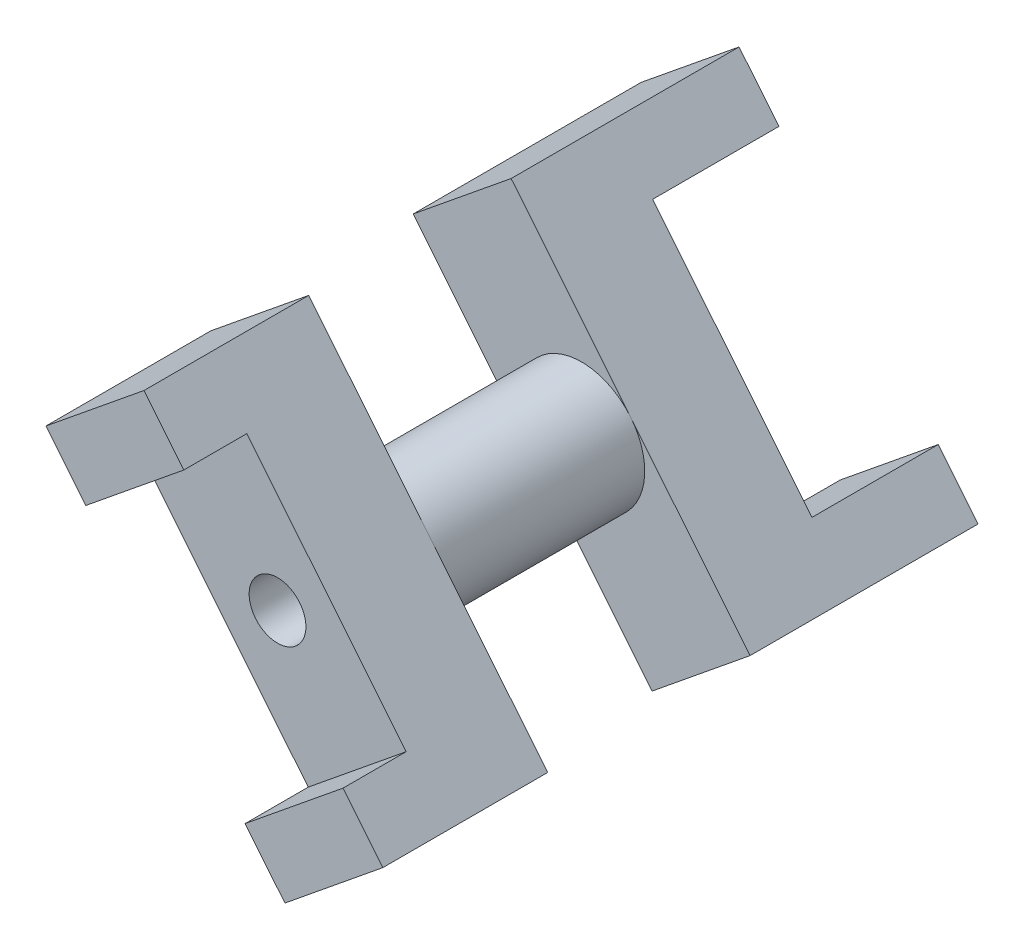
ISO-10303-21;
HEADER;
FILE_DESCRIPTION(('STEP AP214'),'2;1');
FILE_NAME('part.step','',(''),(''),'','','');
FILE_SCHEMA(('AUTOMOTIVE_DESIGN { 1 0 10303 214 1 1 1 1 }'));
ENDSEC;
DATA;
#1=APPLICATION_CONTEXT('core data for automotive mechanical design processes');
#2=APPLICATION_PROTOCOL_DEFINITION('international standard','automotive_design',2000,#1);
#3=PRODUCT_CONTEXT('',#1,'mechanical');
#4=PRODUCT('Part','Part','',(#3));
#5=PRODUCT_RELATED_PRODUCT_CATEGORY('part','',(#4));
#6=PRODUCT_DEFINITION_FORMATION('','',#4);
#7=PRODUCT_DEFINITION_CONTEXT('part definition',#1,'design');
#8=PRODUCT_DEFINITION('design','',#6,#7);
#9=PRODUCT_DEFINITION_SHAPE('','',#8);
#10=(LENGTH_UNIT() NAMED_UNIT(*) SI_UNIT(.MILLI.,.METRE.));
#11=(NAMED_UNIT(*) PLANE_ANGLE_UNIT() SI_UNIT($,.RADIAN.));
#12=(NAMED_UNIT(*) SI_UNIT($,.STERADIAN.) SOLID_ANGLE_UNIT());
#13=UNCERTAINTY_MEASURE_WITH_UNIT(LENGTH_MEASURE(1.E-05),#10,'distance_accuracy_value','');
#14=(GEOMETRIC_REPRESENTATION_CONTEXT(3) GLOBAL_UNCERTAINTY_ASSIGNED_CONTEXT((#13)) GLOBAL_UNIT_ASSIGNED_CONTEXT((#10,
#11,#12)) REPRESENTATION_CONTEXT('',''));
#15=CARTESIAN_POINT('',(0.,0.,0.));
#16=DIRECTION('',(0.,0.,1.));
#17=DIRECTION('',(1.,0.,0.));
#18=AXIS2_PLACEMENT_3D('',#15,#16,#17);
#19=CARTESIAN_POINT('',(0.,0.,27.7786382122968));
#20=DIRECTION('',(0.,0.,-1.));
#21=DIRECTION('',(-1.,0.,0.));
#22=AXIS2_PLACEMENT_3D('',#19,#20,#21);
#23=CYLINDRICAL_SURFACE('',#22,3.);
#24=CARTESIAN_POINT('',(0.,0.,4.83606185530663));
#25=DIRECTION('',(0.,0.,1.));
#26=DIRECTION('',(1.,0.,0.));
#27=AXIS2_PLACEMENT_3D('',#24,#25,#26);
#28=CIRCLE('',#27,3.);
#29=CARTESIAN_POINT('',(-2.32729027640222,-1.89307157005848,4.83606185530663));
#30=VERTEX_POINT('',#29);
#31=CARTESIAN_POINT('',(2.32729027640222,1.89307157005847,4.83606185530663));
#32=VERTEX_POINT('',#31);
#33=EDGE_CURVE('E202',#30,#32,#28,.T.);
#34=ORIENTED_EDGE('',*,*,#33,.T.);
#35=EDGE_CURVE('E174',#32,#30,#28,.T.);
#36=ORIENTED_EDGE('',*,*,#35,.T.);
#37=EDGE_LOOP('',(#34,#36));
#38=FACE_BOUND('',#37,.T.);
#39=CARTESIAN_POINT('',(0.,0.,14.4572949827516));
#40=DIRECTION('',(0.,0.,-1.));
#41=DIRECTION('',(0.,1.,0.));
#42=AXIS2_PLACEMENT_3D('',#39,#40,#41);
#43=CIRCLE('',#42,3.);
#44=CARTESIAN_POINT('',(-2.32729027640222,-1.89307157005848,14.4572949827516));
#45=VERTEX_POINT('',#44);
#46=CARTESIAN_POINT('',(2.32729027640222,1.89307157005847,14.4572949827516));
#47=VERTEX_POINT('',#46);
#48=EDGE_CURVE('E294',#45,#47,#43,.T.);
#49=ORIENTED_EDGE('',*,*,#48,.T.);
#50=EDGE_CURVE('E297',#47,#45,#43,.T.);
#51=ORIENTED_EDGE('',*,*,#50,.T.);
#52=EDGE_LOOP('',(#49,#51));
#53=FACE_BOUND('',#52,.T.);
#54=ADVANCED_FACE('F40',(#38,#53),#23,.T.);
#55=CARTESIAN_POINT('',(24.3052970762707,8.16901402016077,14.4572949827516));
#56=DIRECTION('',(0.,0.,-1.));
#57=DIRECTION('',(0.,1.,0.));
#58=AXIS2_PLACEMENT_3D('',#55,#56,#57);
#59=PLANE('',#58);
#60=ORIENTED_EDGE('',*,*,#50,.F.);
#61=DIRECTION('',(0.631023856686159,-0.775763425467408,0.));
#62=VECTOR('',#61,1.);
#63=CARTESIAN_POINT('',(8.00650498657763,-5.08879925914817,14.4572949827516));
#64=LINE('',#63,#62);
#65=CARTESIAN_POINT('',(8.00650498657764,-5.08879925914818,14.4572949827516));
#66=VERTEX_POINT('',#65);
#67=EDGE_CURVE('E265',#47,#66,#64,.T.);
#68=ORIENTED_EDGE('',*,*,#67,.T.);
#69=DIRECTION('',(-0.775763425467407,-0.631023856686159,0.));
#70=VECTOR('',#69,1.);
#71=CARTESIAN_POINT('',(24.3052970762707,8.16901402016077,14.4572949827516));
#72=LINE('',#71,#70);
#73=CARTESIAN_POINT('',(3.3519244337732,-8.87494239926513,14.4572949827516));
#74=VERTEX_POINT('',#73);
#75=EDGE_CURVE('E262',#66,#74,#72,.T.);
#76=ORIENTED_EDGE('',*,*,#75,.T.);
#77=DIRECTION('',(0.631023856686159,-0.775763425467407,0.));
#78=VECTOR('',#77,1.);
#79=CARTESIAN_POINT('',(3.3519244337732,-8.87494239926513,14.4572949827516));
#80=LINE('',#79,#78);
#81=EDGE_CURVE('E227',#45,#74,#80,.T.);
#82=ORIENTED_EDGE('',*,*,#81,.F.);
#83=EDGE_LOOP('',(#60,#68,#76,#82));
#84=FACE_BOUND('',#83,.T.);
#85=ADVANCED_FACE('F308',(#84),#59,.T.);
#86=CARTESIAN_POINT('',(-3.3519244337732,8.87494239926513,12.5851529055589));
#87=DIRECTION('',(0.775763425467408,0.631023856686159,0.));
#88=DIRECTION('',(-0.631023856686159,0.775763425467408,0.));
#89=AXIS2_PLACEMENT_3D('',#86,#87,#88);
#90=PLANE('',#89);
#91=ORIENTED_EDGE('',*,*,#67,.F.);
#92=CARTESIAN_POINT('',(-3.35192443377321,8.87494239926513,14.4572949827516));
#93=VERTEX_POINT('',#92);
#94=EDGE_CURVE('E64',#93,#47,#64,.T.);
#95=ORIENTED_EDGE('',*,*,#94,.F.);
#96=DIRECTION('',(0.,0.,-1.));
#97=VECTOR('',#96,1.);
#98=CARTESIAN_POINT('',(-3.35192443377321,8.87494239926513,19.2933568380583));
#99=LINE('',#98,#97);
#100=CARTESIAN_POINT('',(-3.35192443377321,8.87494239926514,22.2933568380583));
#101=VERTEX_POINT('',#100);
#102=EDGE_CURVE('E266',#101,#93,#99,.T.);
#103=ORIENTED_EDGE('',*,*,#102,.F.);
#104=DIRECTION('',(-0.631023856686159,0.775763425467408,0.));
#105=VECTOR('',#104,1.);
#106=CARTESIAN_POINT('',(-3.35192443377321,8.87494239926514,22.2933568380583));
#107=LINE('',#106,#105);
#108=CARTESIAN_POINT('',(-1.45885286371473,6.54765212286291,22.2933568380583));
#109=VERTEX_POINT('',#108);
#110=EDGE_CURVE('E272',#109,#101,#107,.T.);
#111=ORIENTED_EDGE('',*,*,#110,.F.);
#112=DIRECTION('',(0.,0.,1.));
#113=VECTOR('',#112,1.);
#114=CARTESIAN_POINT('',(-1.45885286371473,6.54765212286291,22.2933568380583));
#115=LINE('',#114,#113);
#116=CARTESIAN_POINT('',(-1.45885286371473,6.54765212286291,19.2933568380583));
#117=VERTEX_POINT('',#116);
#118=EDGE_CURVE('E214',#117,#109,#115,.T.);
#119=ORIENTED_EDGE('',*,*,#118,.F.);
#120=DIRECTION('',(-0.631023856686159,0.775763425467408,0.));
#121=VECTOR('',#120,1.);
#122=CARTESIAN_POINT('',(4.22036184646078,-0.434218706343846,19.2933568380583));
#123=LINE('',#122,#121);
#124=CARTESIAN_POINT('',(6.11343341651917,-2.76150898274596,19.2933568380583));
#125=VERTEX_POINT('',#124);
#126=EDGE_CURVE('E243',#125,#117,#123,.T.);
#127=ORIENTED_EDGE('',*,*,#126,.F.);
#128=DIRECTION('',(0.,0.,-1.));
#129=VECTOR('',#128,1.);
#130=CARTESIAN_POINT('',(6.11343341651917,-2.76150898274596,22.2933568380583));
#131=LINE('',#130,#129);
#132=CARTESIAN_POINT('',(6.11343341651917,-2.76150898274596,22.2933568380583));
#133=VERTEX_POINT('',#132);
#134=EDGE_CURVE('E248',#133,#125,#131,.T.);
#135=ORIENTED_EDGE('',*,*,#134,.F.);
#136=DIRECTION('',(-0.631023856686159,0.775763425467408,0.));
#137=VECTOR('',#136,1.);
#138=CARTESIAN_POINT('',(8.00650498657763,-5.08879925914818,22.2933568380583));
#139=LINE('',#138,#137);
#140=CARTESIAN_POINT('',(8.00650498657764,-5.08879925914819,22.2933568380583));
#141=VERTEX_POINT('',#140);
#142=EDGE_CURVE('E253',#141,#133,#139,.T.);
#143=ORIENTED_EDGE('',*,*,#142,.F.);
#144=DIRECTION('',(0.,0.,1.));
#145=VECTOR('',#144,1.);
#146=CARTESIAN_POINT('',(8.00650498657764,-5.08879925914818,19.2933568380583));
#147=LINE('',#146,#145);
#148=EDGE_CURVE('E258',#66,#141,#147,.T.);
#149=ORIENTED_EDGE('',*,*,#148,.F.);
#150=EDGE_LOOP('',(#91,#95,#103,#111,#119,#127,#135,#143,#149));
#151=FACE_BOUND('',#150,.T.);
#152=ADVANCED_FACE('F322',(#151),#90,.T.);
#153=CARTESIAN_POINT('',(-2.32729027640222,-1.89307157005848,0.));
#154=DIRECTION('',(0.775763425467407,0.631023856686159,0.));
#155=DIRECTION('',(-0.631023856686159,0.775763425467407,0.));
#156=AXIS2_PLACEMENT_3D('',#153,#154,#155);
#157=PLANE('',#156);
#158=DIRECTION('',(-0.631023856686159,0.775763425467407,0.));
#159=VECTOR('',#158,1.);
#160=CARTESIAN_POINT('',(-0.434218706343658,-4.22036184646081,19.2933568380583));
#161=LINE('',#160,#159);
#162=CARTESIAN_POINT('',(1.45885286371473,-6.54765212286291,19.2933568380583));
#163=VERTEX_POINT('',#162);
#164=CARTESIAN_POINT('',(-6.11343341651917,2.76150898274595,19.2933568380583));
#165=VERTEX_POINT('',#164);
#166=EDGE_CURVE('E206',#163,#165,#161,.T.);
#167=ORIENTED_EDGE('',*,*,#166,.T.);
#168=DIRECTION('',(0.,0.,1.));
#169=VECTOR('',#168,1.);
#170=CARTESIAN_POINT('',(-6.11343341651917,2.76150898274595,22.2933568380583));
#171=LINE('',#170,#169);
#172=CARTESIAN_POINT('',(-6.11343341651917,2.76150898274595,22.2933568380583));
#173=VERTEX_POINT('',#172);
#174=EDGE_CURVE('E209',#165,#173,#171,.T.);
#175=ORIENTED_EDGE('',*,*,#174,.T.);
#176=DIRECTION('',(-0.63102385668616,0.775763425467407,0.));
#177=VECTOR('',#176,1.);
#178=CARTESIAN_POINT('',(-8.00650498657765,5.08879925914818,22.2933568380583));
#179=LINE('',#178,#177);
#180=CARTESIAN_POINT('',(-8.00650498657765,5.08879925914818,22.2933568380583));
#181=VERTEX_POINT('',#180);
#182=EDGE_CURVE('E232',#173,#181,#179,.T.);
#183=ORIENTED_EDGE('',*,*,#182,.T.);
#184=DIRECTION('',(0.,0.,-1.));
#185=VECTOR('',#184,1.);
#186=CARTESIAN_POINT('',(-8.00650498657765,5.08879925914818,19.2933568380583));
#187=LINE('',#186,#185);
#188=CARTESIAN_POINT('',(-8.00650498657765,5.08879925914818,14.4572949827516));
#189=VERTEX_POINT('',#188);
#190=EDGE_CURVE('E228',#181,#189,#187,.T.);
#191=ORIENTED_EDGE('',*,*,#190,.T.);
#192=EDGE_CURVE('E223',#189,#45,#80,.T.);
#193=ORIENTED_EDGE('',*,*,#192,.T.);
#194=ORIENTED_EDGE('',*,*,#81,.T.);
#195=DIRECTION('',(0.,0.,1.));
#196=VECTOR('',#195,1.);
#197=CARTESIAN_POINT('',(3.3519244337732,-8.87494239926513,19.2933568380583));
#198=LINE('',#197,#196);
#199=CARTESIAN_POINT('',(3.3519244337732,-8.87494239926514,22.2933568380583));
#200=VERTEX_POINT('',#199);
#201=EDGE_CURVE('E219',#74,#200,#198,.T.);
#202=ORIENTED_EDGE('',*,*,#201,.T.);
#203=DIRECTION('',(-0.631023856686159,0.775763425467407,0.));
#204=VECTOR('',#203,1.);
#205=CARTESIAN_POINT('',(3.3519244337732,-8.87494239926514,22.2933568380583));
#206=LINE('',#205,#204);
#207=CARTESIAN_POINT('',(1.45885286371473,-6.54765212286291,22.2933568380583));
#208=VERTEX_POINT('',#207);
#209=EDGE_CURVE('E215',#200,#208,#206,.T.);
#210=ORIENTED_EDGE('',*,*,#209,.T.);
#211=DIRECTION('',(0.,0.,-1.));
#212=VECTOR('',#211,1.);
#213=CARTESIAN_POINT('',(1.45885286371473,-6.54765212286291,22.2933568380583));
#214=LINE('',#213,#212);
#215=EDGE_CURVE('E210',#208,#163,#214,.T.);
#216=ORIENTED_EDGE('',*,*,#215,.T.);
#217=EDGE_LOOP('',(#167,#175,#183,#191,#193,#194,#202,#210,#216));
#218=FACE_BOUND('',#217,.T.);
#219=ADVANCED_FACE('F315',(#218),#157,.F.);
#220=CARTESIAN_POINT('',(14.8399392259783,19.8054654021719,22.2933568380583));
#221=DIRECTION('',(0.631023856686159,-0.775763425467407,0.));
#222=DIRECTION('',(0.775763425467407,0.631023856686159,0.));
#223=AXIS2_PLACEMENT_3D('',#220,#221,#222);
#224=PLANE('',#223);
#225=DIRECTION('',(-0.775763425467407,-0.631023856686159,0.));
#226=VECTOR('',#225,1.);
#227=CARTESIAN_POINT('',(14.8399392259783,19.8054654021719,19.2933568380583));
#228=LINE('',#227,#226);
#229=EDGE_CURVE('E246',#117,#165,#228,.T.);
#230=ORIENTED_EDGE('',*,*,#229,.F.);
#231=ORIENTED_EDGE('',*,*,#118,.T.);
#232=DIRECTION('',(-0.775763425467407,-0.631023856686159,0.));
#233=VECTOR('',#232,1.);
#234=CARTESIAN_POINT('',(14.8399392259783,19.8054654021719,22.2933568380583));
#235=LINE('',#234,#233);
#236=EDGE_CURVE('E242',#109,#173,#235,.T.);
#237=ORIENTED_EDGE('',*,*,#236,.T.);
#238=ORIENTED_EDGE('',*,*,#174,.F.);
#239=EDGE_LOOP('',(#230,#231,#237,#238));
#240=FACE_BOUND('',#239,.T.);
#241=ADVANCED_FACE('F478',(#240),#224,.T.);
#242=CARTESIAN_POINT('',(12.9468676559199,22.1327556785741,22.2933568380583));
#243=DIRECTION('',(0.,0.,1.));
#244=DIRECTION('',(1.,0.,0.));
#245=AXIS2_PLACEMENT_3D('',#242,#243,#244);
#246=PLANE('',#245);
#247=ORIENTED_EDGE('',*,*,#236,.F.);
#248=ORIENTED_EDGE('',*,*,#110,.T.);
#249=DIRECTION('',(-0.775763425467407,-0.631023856686159,0.));
#250=VECTOR('',#249,1.);
#251=CARTESIAN_POINT('',(12.9468676559199,22.1327556785741,22.2933568380583));
#252=LINE('',#251,#250);
#253=EDGE_CURVE('E271',#101,#181,#252,.T.);
#254=ORIENTED_EDGE('',*,*,#253,.T.);
#255=ORIENTED_EDGE('',*,*,#182,.F.);
#256=EDGE_LOOP('',(#247,#248,#254,#255));
#257=FACE_BOUND('',#256,.T.);
#258=ADVANCED_FACE('F474',(#257),#246,.T.);
#259=CARTESIAN_POINT('',(12.9468676559199,22.1327556785741,19.2933568380583));
#260=DIRECTION('',(-0.631023856686159,0.775763425467407,0.));
#261=DIRECTION('',(-0.775763425467407,-0.631023856686159,0.));
#262=AXIS2_PLACEMENT_3D('',#259,#260,#261);
#263=PLANE('',#262);
#264=ORIENTED_EDGE('',*,*,#253,.F.);
#265=ORIENTED_EDGE('',*,*,#102,.T.);
#266=DIRECTION('',(-0.775763425467407,-0.631023856686159,0.));
#267=VECTOR('',#266,1.);
#268=CARTESIAN_POINT('',(12.9468676559199,22.1327556785741,14.4572949827516));
#269=LINE('',#268,#267);
#270=EDGE_CURVE('E270',#93,#189,#269,.T.);
#271=ORIENTED_EDGE('',*,*,#270,.T.);
#272=ORIENTED_EDGE('',*,*,#190,.F.);
#273=EDGE_LOOP('',(#264,#265,#271,#272));
#274=FACE_BOUND('',#273,.T.);
#275=ADVANCED_FACE('F320',(#274),#263,.T.);
#276=ORIENTED_EDGE('',*,*,#48,.F.);
#277=ORIENTED_EDGE('',*,*,#192,.F.);
#278=ORIENTED_EDGE('',*,*,#270,.F.);
#279=ORIENTED_EDGE('',*,*,#94,.T.);
#280=EDGE_LOOP('',(#276,#277,#278,#279));
#281=FACE_BOUND('',#280,.T.);
#282=ADVANCED_FACE('F317',(#281),#59,.T.);
#283=CARTESIAN_POINT('',(24.3052970762707,8.16901402016077,19.2933568380583));
#284=DIRECTION('',(0.631023856686159,-0.775763425467407,0.));
#285=DIRECTION('',(0.775763425467407,0.631023856686159,0.));
#286=AXIS2_PLACEMENT_3D('',#283,#284,#285);
#287=PLANE('',#286);
#288=ORIENTED_EDGE('',*,*,#75,.F.);
#289=ORIENTED_EDGE('',*,*,#148,.T.);
#290=DIRECTION('',(-0.775763425467407,-0.631023856686159,0.));
#291=VECTOR('',#290,1.);
#292=CARTESIAN_POINT('',(24.3052970762707,8.16901402016077,22.2933568380583));
#293=LINE('',#292,#291);
#294=EDGE_CURVE('E257',#141,#200,#293,.T.);
#295=ORIENTED_EDGE('',*,*,#294,.T.);
#296=ORIENTED_EDGE('',*,*,#201,.F.);
#297=EDGE_LOOP('',(#288,#289,#295,#296));
#298=FACE_BOUND('',#297,.T.);
#299=ADVANCED_FACE('F467',(#298),#287,.T.);
#300=CARTESIAN_POINT('',(24.3052970762707,8.16901402016077,22.2933568380583));
#301=DIRECTION('',(0.,0.,1.));
#302=DIRECTION('',(1.,0.,0.));
#303=AXIS2_PLACEMENT_3D('',#300,#301,#302);
#304=PLANE('',#303);
#305=ORIENTED_EDGE('',*,*,#294,.F.);
#306=ORIENTED_EDGE('',*,*,#142,.T.);
#307=DIRECTION('',(-0.775763425467407,-0.631023856686159,0.));
#308=VECTOR('',#307,1.);
#309=CARTESIAN_POINT('',(22.4122255062122,10.496304296563,22.2933568380583));
#310=LINE('',#309,#308);
#311=EDGE_CURVE('E252',#133,#208,#310,.T.);
#312=ORIENTED_EDGE('',*,*,#311,.T.);
#313=ORIENTED_EDGE('',*,*,#209,.F.);
#314=EDGE_LOOP('',(#305,#306,#312,#313));
#315=FACE_BOUND('',#314,.T.);
#316=ADVANCED_FACE('F472',(#315),#304,.T.);
#317=CARTESIAN_POINT('',(22.4122255062122,10.496304296563,22.2933568380583));
#318=DIRECTION('',(-0.631023856686159,0.775763425467407,0.));
#319=DIRECTION('',(-0.775763425467407,-0.631023856686159,0.));
#320=AXIS2_PLACEMENT_3D('',#317,#318,#319);
#321=PLANE('',#320);
#322=ORIENTED_EDGE('',*,*,#311,.F.);
#323=ORIENTED_EDGE('',*,*,#134,.T.);
#324=DIRECTION('',(-0.775763425467407,-0.631023856686159,0.));
#325=VECTOR('',#324,1.);
#326=CARTESIAN_POINT('',(22.4122255062122,10.496304296563,19.2933568380583));
#327=LINE('',#326,#325);
#328=EDGE_CURVE('E247',#125,#163,#327,.T.);
#329=ORIENTED_EDGE('',*,*,#328,.T.);
#330=ORIENTED_EDGE('',*,*,#215,.F.);
#331=EDGE_LOOP('',(#322,#323,#329,#330));
#332=FACE_BOUND('',#331,.T.);
#333=ADVANCED_FACE('F488',(#332),#321,.T.);
#334=CARTESIAN_POINT('',(0.,0.,19.2933568380583));
#335=DIRECTION('',(0.,0.,1.));
#336=DIRECTION('',(0.775763425467408,0.631023856686159,0.));
#337=AXIS2_PLACEMENT_3D('',#334,#335,#336);
#338=PLANE('',#337);
#339=CARTESIAN_POINT('',(0.,0.,19.2933568380583));
#340=DIRECTION('',(0.,0.,1.));
#341=DIRECTION('',(1.,0.,0.));
#342=AXIS2_PLACEMENT_3D('',#339,#340,#341);
#343=CIRCLE('',#342,1.35);
#344=CARTESIAN_POINT('',(1.35,0.,19.2933568380583));
#345=VERTEX_POINT('',#344);
#346=EDGE_CURVE('E401',#345,#345,#343,.T.);
#347=ORIENTED_EDGE('',*,*,#346,.F.);
#348=EDGE_LOOP('',(#347));
#349=FACE_BOUND('',#348,.T.);
#350=ORIENTED_EDGE('',*,*,#328,.F.);
#351=ORIENTED_EDGE('',*,*,#126,.T.);
#352=ORIENTED_EDGE('',*,*,#229,.T.);
#353=ORIENTED_EDGE('',*,*,#166,.F.);
#354=EDGE_LOOP('',(#350,#351,#352,#353));
#355=FACE_BOUND('',#354,.T.);
#356=ADVANCED_FACE('F485',(#349,#355),#338,.T.);
#357=CARTESIAN_POINT('',(-3.3519244337732,8.87494239926513,12.5851529055589));
#358=DIRECTION('',(0.775763425467408,0.631023856686159,0.));
#359=DIRECTION('',(-0.631023856686159,0.775763425467408,0.));
#360=AXIS2_PLACEMENT_3D('',#357,#358,#359);
#361=PLANE('',#360);
#362=DIRECTION('',(0.631023856686159,-0.775763425467408,0.));
#363=VECTOR('',#362,1.);
#364=CARTESIAN_POINT('',(6.11343341651916,-2.76150898274595,0.));
#365=LINE('',#364,#363);
#366=CARTESIAN_POINT('',(-1.45885286371473,6.54765212286291,0.));
#367=VERTEX_POINT('',#366);
#368=CARTESIAN_POINT('',(6.11343341651918,-2.76150898274596,0.));
#369=VERTEX_POINT('',#368);
#370=EDGE_CURVE('E348',#367,#369,#365,.T.);
#371=ORIENTED_EDGE('',*,*,#370,.F.);
#372=DIRECTION('',(0.,0.,1.));
#373=VECTOR('',#372,1.);
#374=CARTESIAN_POINT('',(-1.45885286371472,6.54765212286291,-3.));
#375=LINE('',#374,#373);
#376=CARTESIAN_POINT('',(-1.45885286371473,6.54765212286292,-5.99999999999998));
#377=VERTEX_POINT('',#376);
#378=EDGE_CURVE('E354',#377,#367,#375,.T.);
#379=ORIENTED_EDGE('',*,*,#378,.F.);
#380=DIRECTION('',(0.631023856686159,-0.775763425467408,0.));
#381=VECTOR('',#380,1.);
#382=CARTESIAN_POINT('',(-3.35192443377321,8.87494239926515,-5.99999999999998));
#383=LINE('',#382,#381);
#384=CARTESIAN_POINT('',(-3.35192443377321,8.87494239926514,-5.99999999999998));
#385=VERTEX_POINT('',#384);
#386=EDGE_CURVE('E184',#385,#377,#383,.T.);
#387=ORIENTED_EDGE('',*,*,#386,.F.);
#388=DIRECTION('',(0.,0.,-1.));
#389=VECTOR('',#388,1.);
#390=CARTESIAN_POINT('',(-3.3519244337732,8.87494239926514,-3.));
#391=LINE('',#390,#389);
#392=CARTESIAN_POINT('',(-3.3519244337732,8.87494239926514,4.83606185530663));
#393=VERTEX_POINT('',#392);
#394=EDGE_CURVE('E181',#393,#385,#391,.T.);
#395=ORIENTED_EDGE('',*,*,#394,.F.);
#396=DIRECTION('',(-0.631023856686159,0.775763425467408,0.));
#397=VECTOR('',#396,1.);
#398=CARTESIAN_POINT('',(-3.35192443377321,8.87494239926514,4.83606185530663));
#399=LINE('',#398,#397);
#400=EDGE_CURVE('E166',#32,#393,#399,.T.);
#401=ORIENTED_EDGE('',*,*,#400,.F.);
#402=CARTESIAN_POINT('',(8.00650498657765,-5.08879925914818,4.83606185530663));
#403=VERTEX_POINT('',#402);
#404=EDGE_CURVE('E56',#403,#32,#399,.T.);
#405=ORIENTED_EDGE('',*,*,#404,.F.);
#406=DIRECTION('',(0.,0.,1.));
#407=VECTOR('',#406,1.);
#408=CARTESIAN_POINT('',(8.00650498657764,-5.08879925914818,0.));
#409=LINE('',#408,#407);
#410=CARTESIAN_POINT('',(8.00650498657821,-5.08879925914886,-5.99999999999998));
#411=VERTEX_POINT('',#410);
#412=EDGE_CURVE('E203',#411,#403,#409,.T.);
#413=ORIENTED_EDGE('',*,*,#412,.F.);
#414=DIRECTION('',(0.631023856686159,-0.775763425467408,0.));
#415=VECTOR('',#414,1.);
#416=CARTESIAN_POINT('',(6.11343341651972,-2.76150898274664,-5.99999999999998));
#417=LINE('',#416,#415);
#418=CARTESIAN_POINT('',(6.11343341651973,-2.76150898274665,-5.99999999999998));
#419=VERTEX_POINT('',#418);
#420=EDGE_CURVE('E333',#419,#411,#417,.T.);
#421=ORIENTED_EDGE('',*,*,#420,.F.);
#422=DIRECTION('',(1.86313659576712E-13,-2.28768294111562E-13,-1.));
#423=VECTOR('',#422,1.);
#424=CARTESIAN_POINT('',(6.11343341651917,-2.76150898274596,-3.));
#425=LINE('',#424,#423);
#426=EDGE_CURVE('E340',#369,#419,#425,.T.);
#427=ORIENTED_EDGE('',*,*,#426,.F.);
#428=EDGE_LOOP('',(#371,#379,#387,#395,#401,#405,#413,#421,#427));
#429=FACE_BOUND('',#428,.T.);
#430=ADVANCED_FACE('F182',(#429),#361,.T.);
#431=CARTESIAN_POINT('',(-2.32729027640222,-1.89307157005848,0.));
#432=DIRECTION('',(-0.775763425467407,-0.631023856686159,0.));
#433=DIRECTION('',(0.631023856686159,-0.775763425467407,0.));
#434=AXIS2_PLACEMENT_3D('',#431,#432,#433);
#435=PLANE('',#434);
#436=DIRECTION('',(0.631023856686159,-0.775763425467407,0.));
#437=VECTOR('',#436,1.);
#438=CARTESIAN_POINT('',(1.45885286371473,-6.54765212286291,0.));
#439=LINE('',#438,#437);
#440=CARTESIAN_POINT('',(-6.11343341651917,2.76150898274595,0.));
#441=VERTEX_POINT('',#440);
#442=CARTESIAN_POINT('',(1.45885286371473,-6.54765212286291,0.));
#443=VERTEX_POINT('',#442);
#444=EDGE_CURVE('E386',#441,#443,#439,.T.);
#445=ORIENTED_EDGE('',*,*,#444,.T.);
#446=DIRECTION('',(1.86049092798513E-13,-2.2898349882894E-13,-1.));
#447=VECTOR('',#446,1.);
#448=CARTESIAN_POINT('',(1.45885286371473,-6.54765212286291,-3.));
#449=LINE('',#448,#447);
#450=CARTESIAN_POINT('',(1.45885286371529,-6.5476521228636,-5.99999999999998));
#451=VERTEX_POINT('',#450);
#452=EDGE_CURVE('E389',#443,#451,#449,.T.);
#453=ORIENTED_EDGE('',*,*,#452,.T.);
#454=DIRECTION('',(0.631023856686159,-0.775763425467407,0.));
#455=VECTOR('',#454,1.);
#456=CARTESIAN_POINT('',(1.45885286371529,-6.5476521228636,-5.99999999999998));
#457=LINE('',#456,#455);
#458=CARTESIAN_POINT('',(3.35192443377376,-8.87494239926582,-5.99999999999998));
#459=VERTEX_POINT('',#458);
#460=EDGE_CURVE('E178',#451,#459,#457,.T.);
#461=ORIENTED_EDGE('',*,*,#460,.T.);
#462=DIRECTION('',(0.,0.,1.));
#463=VECTOR('',#462,1.);
#464=CARTESIAN_POINT('',(3.3519244337732,-8.87494239926513,0.));
#465=LINE('',#464,#463);
#466=CARTESIAN_POINT('',(3.3519244337732,-8.87494239926513,4.83606185530664));
#467=VERTEX_POINT('',#466);
#468=EDGE_CURVE('E396',#459,#467,#465,.T.);
#469=ORIENTED_EDGE('',*,*,#468,.T.);
#470=DIRECTION('',(-0.631023856686159,0.775763425467407,0.));
#471=VECTOR('',#470,1.);
#472=CARTESIAN_POINT('',(-8.00650498657765,5.08879925914818,4.83606185530663));
#473=LINE('',#472,#471);
#474=EDGE_CURVE('E379',#467,#30,#473,.T.);
#475=ORIENTED_EDGE('',*,*,#474,.T.);
#476=CARTESIAN_POINT('',(-8.00650498657765,5.08879925914818,4.83606185530663));
#477=VERTEX_POINT('',#476);
#478=EDGE_CURVE('E377',#30,#477,#473,.T.);
#479=ORIENTED_EDGE('',*,*,#478,.T.);
#480=DIRECTION('',(0.,0.,-1.));
#481=VECTOR('',#480,1.);
#482=CARTESIAN_POINT('',(-8.00650498657765,5.08879925914818,-3.));
#483=LINE('',#482,#481);
#484=CARTESIAN_POINT('',(-8.00650498657765,5.08879925914818,-5.99999999999998));
#485=VERTEX_POINT('',#484);
#486=EDGE_CURVE('E192',#477,#485,#483,.T.);
#487=ORIENTED_EDGE('',*,*,#486,.T.);
#488=DIRECTION('',(0.631023856686159,-0.775763425467407,0.));
#489=VECTOR('',#488,1.);
#490=CARTESIAN_POINT('',(-8.00650498657765,5.08879925914818,-5.99999999999998));
#491=LINE('',#490,#489);
#492=CARTESIAN_POINT('',(-6.11343341651917,2.76150898274596,-5.99999999999998));
#493=VERTEX_POINT('',#492);
#494=EDGE_CURVE('E366',#485,#493,#491,.T.);
#495=ORIENTED_EDGE('',*,*,#494,.T.);
#496=DIRECTION('',(0.,0.,1.));
#497=VECTOR('',#496,1.);
#498=CARTESIAN_POINT('',(-6.11343341651917,2.76150898274595,-3.));
#499=LINE('',#498,#497);
#500=EDGE_CURVE('E373',#493,#441,#499,.T.);
#501=ORIENTED_EDGE('',*,*,#500,.T.);
#502=EDGE_LOOP('',(#445,#453,#461,#469,#475,#479,#487,#495,#501));
#503=FACE_BOUND('',#502,.T.);
#504=ADVANCED_FACE('F375',(#503),#435,.T.);
#505=CARTESIAN_POINT('',(12.9468676559199,22.1327556785741,4.83606185530663));
#506=DIRECTION('',(0.,0.,1.));
#507=DIRECTION('',(1.,0.,0.));
#508=AXIS2_PLACEMENT_3D('',#505,#506,#507);
#509=PLANE('',#508);
#510=ORIENTED_EDGE('',*,*,#35,.F.);
#511=ORIENTED_EDGE('',*,*,#400,.T.);
#512=DIRECTION('',(-0.775763425467407,-0.631023856686159,0.));
#513=VECTOR('',#512,1.);
#514=CARTESIAN_POINT('',(12.9468676559199,22.1327556785741,4.83606185530663));
#515=LINE('',#514,#513);
#516=EDGE_CURVE('E171',#393,#477,#515,.T.);
#517=ORIENTED_EDGE('',*,*,#516,.T.);
#518=ORIENTED_EDGE('',*,*,#478,.F.);
#519=EDGE_LOOP('',(#510,#511,#517,#518));
#520=FACE_BOUND('',#519,.T.);
#521=ADVANCED_FACE('F168',(#520),#509,.T.);
#522=ORIENTED_EDGE('',*,*,#33,.F.);
#523=ORIENTED_EDGE('',*,*,#474,.F.);
#524=DIRECTION('',(-0.775763425467407,-0.631023856686159,0.));
#525=VECTOR('',#524,1.);
#526=CARTESIAN_POINT('',(24.3052970762707,8.16901402016077,4.83606185530664));
#527=LINE('',#526,#525);
#528=EDGE_CURVE('E199',#403,#467,#527,.T.);
#529=ORIENTED_EDGE('',*,*,#528,.F.);
#530=ORIENTED_EDGE('',*,*,#404,.T.);
#531=EDGE_LOOP('',(#522,#523,#529,#530));
#532=FACE_BOUND('',#531,.T.);
#533=ADVANCED_FACE('F448',(#532),#509,.T.);
#534=CARTESIAN_POINT('',(12.9468676559199,22.1327556785741,-3.));
#535=DIRECTION('',(-0.631023856686159,0.775763425467407,0.));
#536=DIRECTION('',(-0.775763425467407,-0.631023856686159,0.));
#537=AXIS2_PLACEMENT_3D('',#534,#535,#536);
#538=PLANE('',#537);
#539=ORIENTED_EDGE('',*,*,#516,.F.);
#540=ORIENTED_EDGE('',*,*,#394,.T.);
#541=DIRECTION('',(-0.775763425467407,-0.631023856686159,0.));
#542=VECTOR('',#541,1.);
#543=CARTESIAN_POINT('',(12.9468676559199,22.1327556785741,-5.99999999999998));
#544=LINE('',#543,#542);
#545=EDGE_CURVE('E188',#385,#485,#544,.T.);
#546=ORIENTED_EDGE('',*,*,#545,.T.);
#547=ORIENTED_EDGE('',*,*,#486,.F.);
#548=EDGE_LOOP('',(#539,#540,#546,#547));
#549=FACE_BOUND('',#548,.T.);
#550=ADVANCED_FACE('F190',(#549),#538,.T.);
#551=CARTESIAN_POINT('',(12.9468676559199,22.1327556785741,-5.99999999999998));
#552=DIRECTION('',(0.,0.,-1.));
#553=DIRECTION('',(-1.,0.,0.));
#554=AXIS2_PLACEMENT_3D('',#551,#552,#553);
#555=PLANE('',#554);
#556=ORIENTED_EDGE('',*,*,#545,.F.);
#557=ORIENTED_EDGE('',*,*,#386,.T.);
#558=DIRECTION('',(-0.775763425467407,-0.631023856686159,0.));
#559=VECTOR('',#558,1.);
#560=CARTESIAN_POINT('',(14.8399392259783,19.8054654021719,-5.99999999999998));
#561=LINE('',#560,#559);
#562=EDGE_CURVE('E358',#377,#493,#561,.T.);
#563=ORIENTED_EDGE('',*,*,#562,.T.);
#564=ORIENTED_EDGE('',*,*,#494,.F.);
#565=EDGE_LOOP('',(#556,#557,#563,#564));
#566=FACE_BOUND('',#565,.T.);
#567=ADVANCED_FACE('F367',(#566),#555,.T.);
#568=CARTESIAN_POINT('',(14.8399392259783,19.8054654021719,-3.));
#569=DIRECTION('',(0.631023856686159,-0.775763425467407,0.));
#570=DIRECTION('',(0.775763425467407,0.631023856686159,0.));
#571=AXIS2_PLACEMENT_3D('',#568,#569,#570);
#572=PLANE('',#571);
#573=ORIENTED_EDGE('',*,*,#562,.F.);
#574=ORIENTED_EDGE('',*,*,#378,.T.);
#575=DIRECTION('',(-0.775763425467407,-0.631023856686159,0.));
#576=VECTOR('',#575,1.);
#577=CARTESIAN_POINT('',(14.8399392259783,19.8054654021719,0.));
#578=LINE('',#577,#576);
#579=EDGE_CURVE('E351',#367,#441,#578,.T.);
#580=ORIENTED_EDGE('',*,*,#579,.T.);
#581=ORIENTED_EDGE('',*,*,#500,.F.);
#582=EDGE_LOOP('',(#573,#574,#580,#581));
#583=FACE_BOUND('',#582,.T.);
#584=ADVANCED_FACE('F435',(#583),#572,.T.);
#585=CARTESIAN_POINT('',(22.4122255062122,10.496304296563,-3.));
#586=DIRECTION('',(-0.631023856686159,0.775763425467407,-2.95038439497729E-13));
#587=DIRECTION('',(-0.775763425467407,-0.631023856686159,0.));
#588=AXIS2_PLACEMENT_3D('',#585,#586,#587);
#589=PLANE('',#588);
#590=DIRECTION('',(-0.775763425467407,-0.631023856686159,0.));
#591=VECTOR('',#590,1.);
#592=CARTESIAN_POINT('',(22.4122255062122,10.496304296563,0.));
#593=LINE('',#592,#591);
#594=EDGE_CURVE('E344',#369,#443,#593,.T.);
#595=ORIENTED_EDGE('',*,*,#594,.F.);
#596=ORIENTED_EDGE('',*,*,#426,.T.);
#597=DIRECTION('',(-0.775763425467407,-0.631023856686159,0.));
#598=VECTOR('',#597,1.);
#599=CARTESIAN_POINT('',(22.4122255062128,10.4963042965623,-5.99999999999998));
#600=LINE('',#599,#598);
#601=EDGE_CURVE('E337',#419,#451,#600,.T.);
#602=ORIENTED_EDGE('',*,*,#601,.T.);
#603=ORIENTED_EDGE('',*,*,#452,.F.);
#604=EDGE_LOOP('',(#595,#596,#602,#603));
#605=FACE_BOUND('',#604,.T.);
#606=ADVANCED_FACE('F440',(#605),#589,.T.);
#607=CARTESIAN_POINT('',(22.4122255062128,10.4963042965623,-5.99999999999998));
#608=DIRECTION('',(0.,0.,-1.));
#609=DIRECTION('',(-1.,0.,0.));
#610=AXIS2_PLACEMENT_3D('',#607,#608,#609);
#611=PLANE('',#610);
#612=ORIENTED_EDGE('',*,*,#601,.F.);
#613=ORIENTED_EDGE('',*,*,#420,.T.);
#614=DIRECTION('',(-0.775763425467407,-0.631023856686159,0.));
#615=VECTOR('',#614,1.);
#616=CARTESIAN_POINT('',(24.3052970762713,8.16901402016009,-5.99999999999998));
#617=LINE('',#616,#615);
#618=EDGE_CURVE('E330',#411,#459,#617,.T.);
#619=ORIENTED_EDGE('',*,*,#618,.T.);
#620=ORIENTED_EDGE('',*,*,#460,.F.);
#621=EDGE_LOOP('',(#612,#613,#619,#620));
#622=FACE_BOUND('',#621,.T.);
#623=ADVANCED_FACE('F444',(#622),#611,.T.);
#624=CARTESIAN_POINT('',(24.3052970762707,8.16901402016077,0.));
#625=DIRECTION('',(0.631023856686159,-0.775763425467407,0.));
#626=DIRECTION('',(0.775763425467407,0.631023856686159,0.));
#627=AXIS2_PLACEMENT_3D('',#624,#625,#626);
#628=PLANE('',#627);
#629=ORIENTED_EDGE('',*,*,#618,.F.);
#630=ORIENTED_EDGE('',*,*,#412,.T.);
#631=ORIENTED_EDGE('',*,*,#528,.T.);
#632=ORIENTED_EDGE('',*,*,#468,.F.);
#633=EDGE_LOOP('',(#629,#630,#631,#632));
#634=FACE_BOUND('',#633,.T.);
#635=ADVANCED_FACE('F430',(#634),#628,.T.);
#636=CARTESIAN_POINT('',(0.,0.,0.));
#637=DIRECTION('',(0.,0.,1.));
#638=DIRECTION('',(1.,0.,0.));
#639=AXIS2_PLACEMENT_3D('',#636,#637,#638);
#640=PLANE('',#639);
#641=CARTESIAN_POINT('',(0.,0.,0.));
#642=DIRECTION('',(0.,0.,-1.));
#643=DIRECTION('',(-1.,0.,0.));
#644=AXIS2_PLACEMENT_3D('',#641,#642,#643);
#645=CIRCLE('',#644,1.35);
#646=CARTESIAN_POINT('',(-1.35,0.,0.));
#647=VERTEX_POINT('',#646);
#648=EDGE_CURVE('E409',#647,#647,#645,.T.);
#649=ORIENTED_EDGE('',*,*,#648,.F.);
#650=EDGE_LOOP('',(#649));
#651=FACE_BOUND('',#650,.T.);
#652=ORIENTED_EDGE('',*,*,#579,.F.);
#653=ORIENTED_EDGE('',*,*,#370,.T.);
#654=ORIENTED_EDGE('',*,*,#594,.T.);
#655=ORIENTED_EDGE('',*,*,#444,.F.);
#656=EDGE_LOOP('',(#652,#653,#654,#655));
#657=FACE_BOUND('',#656,.T.);
#658=ADVANCED_FACE('F426',(#651,#657),#640,.F.);
#659=CARTESIAN_POINT('',(0.,0.,15.2933568380583));
#660=DIRECTION('',(0.,0.,1.));
#661=DIRECTION('',(1.,0.,0.));
#662=AXIS2_PLACEMENT_3D('',#659,#660,#661);
#663=CYLINDRICAL_SURFACE('',#662,1.35);
#664=CARTESIAN_POINT('',(0.,0.,15.2933568380583));
#665=DIRECTION('',(0.,0.,1.));
#666=DIRECTION('',(1.,0.,0.));
#667=AXIS2_PLACEMENT_3D('',#664,#665,#666);
#668=CIRCLE('',#667,1.35);
#669=CARTESIAN_POINT('',(1.35,0.,15.2933568380583));
#670=VERTEX_POINT('',#669);
#671=EDGE_CURVE('E400',#670,#670,#668,.T.);
#672=ORIENTED_EDGE('',*,*,#671,.F.);
#673=EDGE_LOOP('',(#672));
#674=FACE_BOUND('',#673,.T.);
#675=ORIENTED_EDGE('',*,*,#346,.T.);
#676=EDGE_LOOP('',(#675));
#677=FACE_BOUND('',#676,.T.);
#678=ADVANCED_FACE('F429',(#674,#677),#663,.F.);
#679=CARTESIAN_POINT('',(0.,0.,15.2933568380583));
#680=DIRECTION('',(0.,0.,1.));
#681=DIRECTION('',(1.,0.,0.));
#682=AXIS2_PLACEMENT_3D('',#679,#680,#681);
#683=PLANE('',#682);
#684=ORIENTED_EDGE('',*,*,#671,.T.);
#685=EDGE_LOOP('',(#684));
#686=FACE_BOUND('',#685,.T.);
#687=ADVANCED_FACE('F422',(#686),#683,.T.);
#688=CARTESIAN_POINT('',(0.,0.,4.));
#689=DIRECTION('',(0.,0.,-1.));
#690=DIRECTION('',(-1.,0.,0.));
#691=AXIS2_PLACEMENT_3D('',#688,#689,#690);
#692=CYLINDRICAL_SURFACE('',#691,1.35);
#693=CARTESIAN_POINT('',(0.,0.,4.));
#694=DIRECTION('',(0.,0.,-1.));
#695=DIRECTION('',(-1.,0.,0.));
#696=AXIS2_PLACEMENT_3D('',#693,#694,#695);
#697=CIRCLE('',#696,1.35);
#698=CARTESIAN_POINT('',(-1.35,0.,4.));
#699=VERTEX_POINT('',#698);
#700=EDGE_CURVE('E405',#699,#699,#697,.T.);
#701=ORIENTED_EDGE('',*,*,#700,.F.);
#702=EDGE_LOOP('',(#701));
#703=FACE_BOUND('',#702,.T.);
#704=ORIENTED_EDGE('',*,*,#648,.T.);
#705=EDGE_LOOP('',(#704));
#706=FACE_BOUND('',#705,.T.);
#707=ADVANCED_FACE('F419',(#703,#706),#692,.F.);
#708=CARTESIAN_POINT('',(0.,0.,4.));
#709=DIRECTION('',(0.,0.,-1.));
#710=DIRECTION('',(-1.,0.,0.));
#711=AXIS2_PLACEMENT_3D('',#708,#709,#710);
#712=PLANE('',#711);
#713=ORIENTED_EDGE('',*,*,#700,.T.);
#714=EDGE_LOOP('',(#713));
#715=FACE_BOUND('',#714,.T.);
#716=ADVANCED_FACE('F417',(#715),#712,.T.);
#717=CLOSED_SHELL('',(#54,#85,#152,#219,#241,#258,#275,#282,#299,#316,#333,#356,#430,#504,#521,
#533,#550,#567,#584,#606,#623,#635,#658,#678,#687,#707,#716));
#718=CARTESIAN_POINT('',(0.,0.,4.83606185530663));
#719=DIRECTION('',(0.,0.,1.));
#720=DIRECTION('',(1.,0.,0.));
#721=AXIS2_PLACEMENT_3D('',#718,#719,#720);
#722=CIRCLE('',#721,1.35);
#723=CARTESIAN_POINT('',(1.35,0.,4.83606185530663));
#724=VERTEX_POINT('',#723);
#725=EDGE_CURVE('E11',#724,#724,#722,.T.);
#726=ORIENTED_EDGE('',*,*,#725,.T.);
#727=EDGE_LOOP('',(#726));
#728=FACE_BOUND('',#727,.T.);
#729=ADVANCED_FACE('F464',(#728),#509,.T.);
#730=CARTESIAN_POINT('',(0.,0.,14.4572949827516));
#731=DIRECTION('',(0.,0.,-1.));
#732=DIRECTION('',(0.,1.,0.));
#733=AXIS2_PLACEMENT_3D('',#730,#731,#732);
#734=CIRCLE('',#733,1.35);
#735=CARTESIAN_POINT('',(0.,1.35,14.4572949827516));
#736=VERTEX_POINT('',#735);
#737=EDGE_CURVE('E49',#736,#736,#734,.T.);
#738=ORIENTED_EDGE('',*,*,#737,.T.);
#739=EDGE_LOOP('',(#738));
#740=FACE_BOUND('',#739,.T.);
#741=ADVANCED_FACE('F455',(#740),#59,.T.);
#742=CARTESIAN_POINT('',(0.,0.,27.7786382122968));
#743=DIRECTION('',(0.,0.,-1.));
#744=DIRECTION('',(-1.,0.,0.));
#745=AXIS2_PLACEMENT_3D('',#742,#743,#744);
#746=CYLINDRICAL_SURFACE('',#745,1.35);
#747=ORIENTED_EDGE('',*,*,#725,.F.);
#748=EDGE_LOOP('',(#747));
#749=FACE_BOUND('',#748,.T.);
#750=ORIENTED_EDGE('',*,*,#737,.F.);
#751=EDGE_LOOP('',(#750));
#752=FACE_BOUND('',#751,.T.);
#753=ADVANCED_FACE('F463',(#749,#752),#746,.F.);
#754=CLOSED_SHELL('',(#729,#741,#753));
#755=ORIENTED_CLOSED_SHELL('',*,#754,.T.);
#756=BREP_WITH_VOIDS('B2',#717,(#755));
#757=ADVANCED_BREP_SHAPE_REPRESENTATION('',(#18,#756),#14);
#758=SHAPE_DEFINITION_REPRESENTATION(#9,#757);
ENDSEC;
END-ISO-10303-21;
